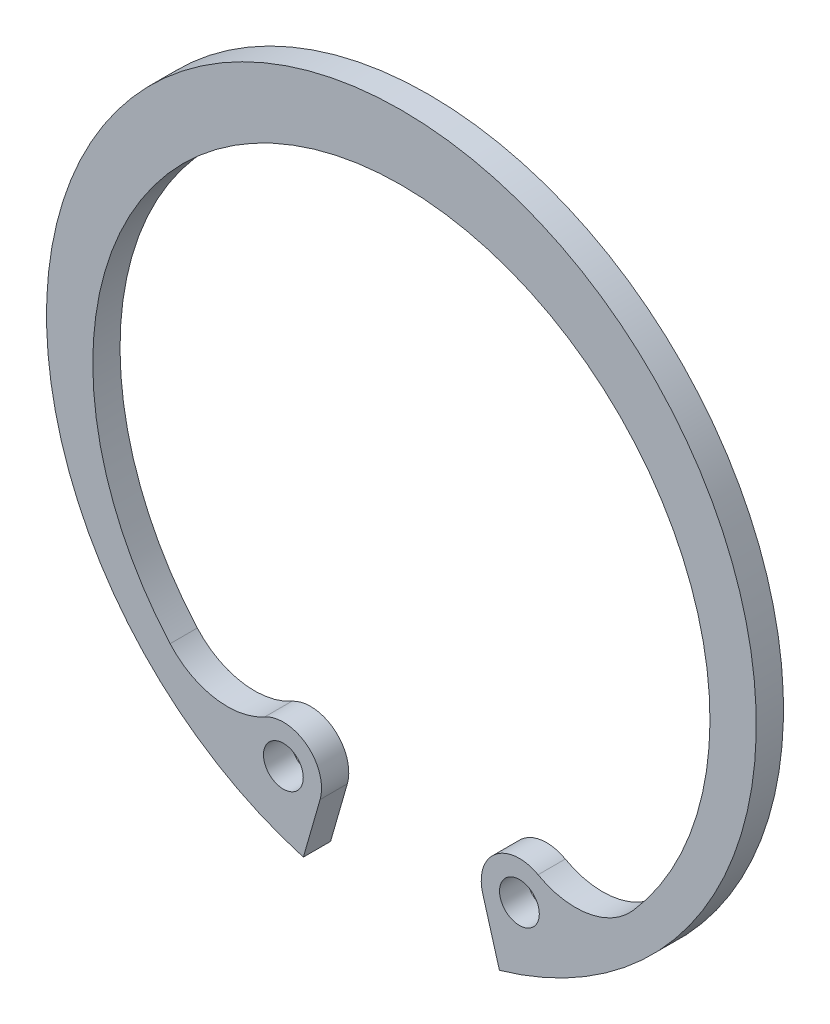
ISO-10303-21;
HEADER;
FILE_DESCRIPTION(('STEP AP214'),'2;1');
FILE_NAME('part.step','',(''),(''),'','','');
FILE_SCHEMA(('AUTOMOTIVE_DESIGN { 1 0 10303 214 1 1 1 1 }'));
ENDSEC;
DATA;
#1=APPLICATION_CONTEXT('core data for automotive mechanical design processes');
#2=APPLICATION_PROTOCOL_DEFINITION('international standard','automotive_design',2000,#1);
#3=PRODUCT_CONTEXT('',#1,'mechanical');
#4=PRODUCT('Part','Part','',(#3));
#5=PRODUCT_RELATED_PRODUCT_CATEGORY('part','',(#4));
#6=PRODUCT_DEFINITION_FORMATION('','',#4);
#7=PRODUCT_DEFINITION_CONTEXT('part definition',#1,'design');
#8=PRODUCT_DEFINITION('design','',#6,#7);
#9=PRODUCT_DEFINITION_SHAPE('','',#8);
#10=(LENGTH_UNIT() NAMED_UNIT(*) SI_UNIT(.MILLI.,.METRE.));
#11=(NAMED_UNIT(*) PLANE_ANGLE_UNIT() SI_UNIT($,.RADIAN.));
#12=(NAMED_UNIT(*) SI_UNIT($,.STERADIAN.) SOLID_ANGLE_UNIT());
#13=UNCERTAINTY_MEASURE_WITH_UNIT(LENGTH_MEASURE(1.E-05),#10,'distance_accuracy_value','');
#14=(GEOMETRIC_REPRESENTATION_CONTEXT(3) GLOBAL_UNCERTAINTY_ASSIGNED_CONTEXT((#13)) GLOBAL_UNIT_ASSIGNED_CONTEXT((#10,
#11,#12)) REPRESENTATION_CONTEXT('',''));
#15=CARTESIAN_POINT('',(0.,0.,0.));
#16=DIRECTION('',(0.,0.,1.));
#17=DIRECTION('',(1.,0.,0.));
#18=AXIS2_PLACEMENT_3D('',#15,#16,#17);
#19=CARTESIAN_POINT('',(0.,0.,-1.3));
#20=DIRECTION('',(0.,0.,1.));
#21=DIRECTION('',(1.,0.,0.));
#22=AXIS2_PLACEMENT_3D('',#19,#20,#21);
#23=CYLINDRICAL_SURFACE('',#22,16.95);
#24=CARTESIAN_POINT('',(0.,0.,0.));
#25=DIRECTION('',(0.,0.,1.));
#26=DIRECTION('',(1.,0.,0.));
#27=AXIS2_PLACEMENT_3D('',#24,#25,#26);
#28=CIRCLE('',#27,16.95);
#29=CARTESIAN_POINT('',(4.68211859774579,-16.2904961691363,0.));
#30=VERTEX_POINT('',#29);
#31=CARTESIAN_POINT('',(-4.68211859774579,-16.2904961691363,0.));
#32=VERTEX_POINT('',#31);
#33=EDGE_CURVE('E129',#30,#32,#28,.T.);
#34=ORIENTED_EDGE('',*,*,#33,.F.);
#35=DIRECTION('',(0.,0.,1.));
#36=VECTOR('',#35,1.);
#37=CARTESIAN_POINT('',(4.68211859774579,-16.2904961691363,-1.3));
#38=LINE('',#37,#36);
#39=CARTESIAN_POINT('',(4.68211859774579,-16.2904961691363,-1.3));
#40=VERTEX_POINT('',#39);
#41=EDGE_CURVE('E11',#40,#30,#38,.T.);
#42=ORIENTED_EDGE('',*,*,#41,.F.);
#43=CARTESIAN_POINT('',(0.,0.,-1.3));
#44=DIRECTION('',(0.,0.,1.));
#45=DIRECTION('',(1.,0.,0.));
#46=AXIS2_PLACEMENT_3D('',#43,#44,#45);
#47=CIRCLE('',#46,16.95);
#48=CARTESIAN_POINT('',(-4.68211859774579,-16.2904961691363,-1.3));
#49=VERTEX_POINT('',#48);
#50=EDGE_CURVE('E150',#40,#49,#47,.T.);
#51=ORIENTED_EDGE('',*,*,#50,.T.);
#52=DIRECTION('',(0.,0.,1.));
#53=VECTOR('',#52,1.);
#54=CARTESIAN_POINT('',(-4.68211859774579,-16.2904961691363,-1.3));
#55=LINE('',#54,#53);
#56=EDGE_CURVE('E35',#49,#32,#55,.T.);
#57=ORIENTED_EDGE('',*,*,#56,.T.);
#58=EDGE_LOOP('',(#34,#42,#51,#57));
#59=FACE_BOUND('',#58,.T.);
#60=ADVANCED_FACE('F32',(#59),#23,.T.);
#61=CARTESIAN_POINT('',(4.68211859774579,-16.2904961691363,-1.3));
#62=DIRECTION('',(-0.961091219418068,-0.276231185707717,0.));
#63=DIRECTION('',(0.276231185707717,-0.961091219418068,0.));
#64=AXIS2_PLACEMENT_3D('',#61,#62,#63);
#65=PLANE('',#64);
#66=DIRECTION('',(0.276231185707717,-0.961091219418068,0.));
#67=VECTOR('',#66,1.);
#68=CARTESIAN_POINT('',(4.68211859774579,-16.2904961691363,0.));
#69=LINE('',#68,#67);
#70=CARTESIAN_POINT('',(3.88298915635882,-13.5100849446478,0.));
#71=VERTEX_POINT('',#70);
#72=EDGE_CURVE('E148',#71,#30,#69,.T.);
#73=ORIENTED_EDGE('',*,*,#72,.F.);
#74=DIRECTION('',(0.,0.,1.));
#75=VECTOR('',#74,1.);
#76=CARTESIAN_POINT('',(3.88298915635882,-13.5100849446478,-1.3));
#77=LINE('',#76,#75);
#78=CARTESIAN_POINT('',(3.88298915635882,-13.5100849446478,-1.3));
#79=VERTEX_POINT('',#78);
#80=EDGE_CURVE('E41',#79,#71,#77,.T.);
#81=ORIENTED_EDGE('',*,*,#80,.F.);
#82=DIRECTION('',(0.276231185707717,-0.961091219418068,0.));
#83=VECTOR('',#82,1.);
#84=CARTESIAN_POINT('',(4.68211859774579,-16.2904961691363,-1.3));
#85=LINE('',#84,#83);
#86=EDGE_CURVE('E119',#79,#40,#85,.T.);
#87=ORIENTED_EDGE('',*,*,#86,.T.);
#88=ORIENTED_EDGE('',*,*,#41,.T.);
#89=EDGE_LOOP('',(#73,#81,#87,#88));
#90=FACE_BOUND('',#89,.T.);
#91=ADVANCED_FACE('F162',(#90),#65,.T.);
#92=CARTESIAN_POINT('',(5.6369806317968,-13.0059630307312,-1.3));
#93=DIRECTION('',(0.,0.,1.));
#94=DIRECTION('',(1.,0.,0.));
#95=AXIS2_PLACEMENT_3D('',#92,#93,#94);
#96=CYLINDRICAL_SURFACE('',#95,1.825);
#97=CARTESIAN_POINT('',(5.6369806317968,-13.0059630307312,0.));
#98=DIRECTION('',(0.,0.,1.));
#99=DIRECTION('',(1.,0.,0.));
#100=AXIS2_PLACEMENT_3D('',#97,#98,#99);
#101=CIRCLE('',#100,1.825);
#102=CARTESIAN_POINT('',(6.52840569211607,-11.4134849737914,0.));
#103=VERTEX_POINT('',#102);
#104=EDGE_CURVE('E106',#103,#71,#101,.T.);
#105=ORIENTED_EDGE('',*,*,#104,.F.);
#106=DIRECTION('',(0.,0.,1.));
#107=VECTOR('',#106,1.);
#108=CARTESIAN_POINT('',(6.52840569211607,-11.4134849737914,-1.3));
#109=LINE('',#108,#107);
#110=CARTESIAN_POINT('',(6.52840569211607,-11.4134849737914,-1.3));
#111=VERTEX_POINT('',#110);
#112=EDGE_CURVE('E101',#111,#103,#109,.T.);
#113=ORIENTED_EDGE('',*,*,#112,.F.);
#114=CARTESIAN_POINT('',(5.6369806317968,-13.0059630307312,-1.3));
#115=DIRECTION('',(0.,0.,1.));
#116=DIRECTION('',(1.,0.,0.));
#117=AXIS2_PLACEMENT_3D('',#114,#115,#116);
#118=CIRCLE('',#117,1.825);
#119=EDGE_CURVE('E104',#111,#79,#118,.T.);
#120=ORIENTED_EDGE('',*,*,#119,.T.);
#121=ORIENTED_EDGE('',*,*,#80,.T.);
#122=EDGE_LOOP('',(#105,#113,#120,#121));
#123=FACE_BOUND('',#122,.T.);
#124=ADVANCED_FACE('F103',(#123),#96,.T.);
#125=CARTESIAN_POINT('',(8.31125581275463,-8.22852885991183,-1.3));
#126=DIRECTION('',(0.,0.,1.));
#127=DIRECTION('',(1.,0.,0.));
#128=AXIS2_PLACEMENT_3D('',#125,#126,#127);
#129=CYLINDRICAL_SURFACE('',#128,3.65);
#130=CARTESIAN_POINT('',(8.31125581275463,-8.22852885991183,0.));
#131=DIRECTION('',(0.,0.,-1.));
#132=DIRECTION('',(1.,0.,0.));
#133=AXIS2_PLACEMENT_3D('',#130,#131,#132);
#134=CIRCLE('',#133,3.65);
#135=CARTESIAN_POINT('',(11.0470830170426,-10.6446723797132,0.));
#136=VERTEX_POINT('',#135);
#137=EDGE_CURVE('E145',#136,#103,#134,.T.);
#138=ORIENTED_EDGE('',*,*,#137,.F.);
#139=DIRECTION('',(0.,0.,1.));
#140=VECTOR('',#139,1.);
#141=CARTESIAN_POINT('',(11.0470830170426,-10.6446723797132,-1.3));
#142=LINE('',#141,#140);
#143=CARTESIAN_POINT('',(11.0470830170426,-10.6446723797132,-1.3));
#144=VERTEX_POINT('',#143);
#145=EDGE_CURVE('E111',#144,#136,#142,.T.);
#146=ORIENTED_EDGE('',*,*,#145,.F.);
#147=CARTESIAN_POINT('',(8.31125581275463,-8.22852885991183,-1.3));
#148=DIRECTION('',(0.,0.,-1.));
#149=DIRECTION('',(1.,0.,0.));
#150=AXIS2_PLACEMENT_3D('',#147,#148,#149);
#151=CIRCLE('',#150,3.65);
#152=EDGE_CURVE('E117',#144,#111,#151,.T.);
#153=ORIENTED_EDGE('',*,*,#152,.T.);
#154=ORIENTED_EDGE('',*,*,#112,.T.);
#155=EDGE_LOOP('',(#138,#146,#153,#154));
#156=FACE_BOUND('',#155,.T.);
#157=ADVANCED_FACE('F121',(#156),#129,.F.);
#158=CARTESIAN_POINT('',(0.,-0.888450202193896,-1.3));
#159=DIRECTION('',(0.,0.,1.));
#160=DIRECTION('',(1.,0.,0.));
#161=AXIS2_PLACEMENT_3D('',#158,#159,#160);
#162=CYLINDRICAL_SURFACE('',#161,14.7384502021939);
#163=CARTESIAN_POINT('',(0.,-0.888450202193896,0.));
#164=DIRECTION('',(0.,0.,-1.));
#165=DIRECTION('',(1.,0.,0.));
#166=AXIS2_PLACEMENT_3D('',#163,#164,#165);
#167=CIRCLE('',#166,14.7384502021939);
#168=CARTESIAN_POINT('',(-11.0470830170426,-10.6446723797132,0.));
#169=VERTEX_POINT('',#168);
#170=EDGE_CURVE('E142',#169,#136,#167,.T.);
#171=ORIENTED_EDGE('',*,*,#170,.F.);
#172=DIRECTION('',(0.,0.,1.));
#173=VECTOR('',#172,1.);
#174=CARTESIAN_POINT('',(-11.0470830170426,-10.6446723797132,-1.3));
#175=LINE('',#174,#173);
#176=CARTESIAN_POINT('',(-11.0470830170426,-10.6446723797132,-1.3));
#177=VERTEX_POINT('',#176);
#178=EDGE_CURVE('E154',#177,#169,#175,.T.);
#179=ORIENTED_EDGE('',*,*,#178,.F.);
#180=CARTESIAN_POINT('',(0.,-0.888450202193896,-1.3));
#181=DIRECTION('',(0.,0.,-1.));
#182=DIRECTION('',(1.,0.,0.));
#183=AXIS2_PLACEMENT_3D('',#180,#181,#182);
#184=CIRCLE('',#183,14.7384502021939);
#185=EDGE_CURVE('E122',#177,#144,#184,.T.);
#186=ORIENTED_EDGE('',*,*,#185,.T.);
#187=ORIENTED_EDGE('',*,*,#145,.T.);
#188=EDGE_LOOP('',(#171,#179,#186,#187));
#189=FACE_BOUND('',#188,.T.);
#190=ADVANCED_FACE('F175',(#189),#162,.F.);
#191=CARTESIAN_POINT('',(-8.31125581275462,-8.22852885991183,-1.3));
#192=DIRECTION('',(0.,0.,1.));
#193=DIRECTION('',(1.,0.,0.));
#194=AXIS2_PLACEMENT_3D('',#191,#192,#193);
#195=CYLINDRICAL_SURFACE('',#194,3.65);
#196=CARTESIAN_POINT('',(-8.31125581275462,-8.22852885991183,0.));
#197=DIRECTION('',(0.,0.,-1.));
#198=DIRECTION('',(1.,0.,0.));
#199=AXIS2_PLACEMENT_3D('',#196,#197,#198);
#200=CIRCLE('',#199,3.65);
#201=CARTESIAN_POINT('',(-6.52840569211607,-11.4134849737914,0.));
#202=VERTEX_POINT('',#201);
#203=EDGE_CURVE('E139',#202,#169,#200,.T.);
#204=ORIENTED_EDGE('',*,*,#203,.F.);
#205=DIRECTION('',(0.,0.,1.));
#206=VECTOR('',#205,1.);
#207=CARTESIAN_POINT('',(-6.52840569211607,-11.4134849737914,-1.3));
#208=LINE('',#207,#206);
#209=CARTESIAN_POINT('',(-6.52840569211607,-11.4134849737914,-1.3));
#210=VERTEX_POINT('',#209);
#211=EDGE_CURVE('E156',#210,#202,#208,.T.);
#212=ORIENTED_EDGE('',*,*,#211,.F.);
#213=CARTESIAN_POINT('',(-8.31125581275462,-8.22852885991183,-1.3));
#214=DIRECTION('',(0.,0.,-1.));
#215=DIRECTION('',(1.,0.,0.));
#216=AXIS2_PLACEMENT_3D('',#213,#214,#215);
#217=CIRCLE('',#216,3.65);
#218=EDGE_CURVE('E124',#210,#177,#217,.T.);
#219=ORIENTED_EDGE('',*,*,#218,.T.);
#220=ORIENTED_EDGE('',*,*,#178,.T.);
#221=EDGE_LOOP('',(#204,#212,#219,#220));
#222=FACE_BOUND('',#221,.T.);
#223=ADVANCED_FACE('F178',(#222),#195,.F.);
#224=CARTESIAN_POINT('',(-5.6369806317968,-13.0059630307312,-1.3));
#225=DIRECTION('',(0.,0.,1.));
#226=DIRECTION('',(1.,0.,0.));
#227=AXIS2_PLACEMENT_3D('',#224,#225,#226);
#228=CYLINDRICAL_SURFACE('',#227,1.825);
#229=CARTESIAN_POINT('',(-5.6369806317968,-13.0059630307312,0.));
#230=DIRECTION('',(0.,0.,1.));
#231=DIRECTION('',(1.,0.,0.));
#232=AXIS2_PLACEMENT_3D('',#229,#230,#231);
#233=CIRCLE('',#232,1.825);
#234=CARTESIAN_POINT('',(-3.88298915635882,-13.5100849446478,0.));
#235=VERTEX_POINT('',#234);
#236=EDGE_CURVE('E136',#235,#202,#233,.T.);
#237=ORIENTED_EDGE('',*,*,#236,.F.);
#238=DIRECTION('',(0.,0.,1.));
#239=VECTOR('',#238,1.);
#240=CARTESIAN_POINT('',(-3.88298915635882,-13.5100849446478,-1.3));
#241=LINE('',#240,#239);
#242=CARTESIAN_POINT('',(-3.88298915635882,-13.5100849446478,-1.3));
#243=VERTEX_POINT('',#242);
#244=EDGE_CURVE('E157',#243,#235,#241,.T.);
#245=ORIENTED_EDGE('',*,*,#244,.F.);
#246=CARTESIAN_POINT('',(-5.6369806317968,-13.0059630307312,-1.3));
#247=DIRECTION('',(0.,0.,1.));
#248=DIRECTION('',(1.,0.,0.));
#249=AXIS2_PLACEMENT_3D('',#246,#247,#248);
#250=CIRCLE('',#249,1.825);
#251=EDGE_CURVE('E224',#243,#210,#250,.T.);
#252=ORIENTED_EDGE('',*,*,#251,.T.);
#253=ORIENTED_EDGE('',*,*,#211,.T.);
#254=EDGE_LOOP('',(#237,#245,#252,#253));
#255=FACE_BOUND('',#254,.T.);
#256=ADVANCED_FACE('F182',(#255),#228,.T.);
#257=CARTESIAN_POINT('',(-4.68211859774579,-16.2904961691363,-1.3));
#258=DIRECTION('',(0.961091219418068,-0.276231185707716,0.));
#259=DIRECTION('',(0.276231185707716,0.961091219418068,0.));
#260=AXIS2_PLACEMENT_3D('',#257,#258,#259);
#261=PLANE('',#260);
#262=DIRECTION('',(0.276231185707716,0.961091219418068,0.));
#263=VECTOR('',#262,1.);
#264=CARTESIAN_POINT('',(-4.68211859774579,-16.2904961691363,0.));
#265=LINE('',#264,#263);
#266=EDGE_CURVE('E132',#32,#235,#265,.T.);
#267=ORIENTED_EDGE('',*,*,#266,.F.);
#268=ORIENTED_EDGE('',*,*,#56,.F.);
#269=DIRECTION('',(0.276231185707716,0.961091219418068,0.));
#270=VECTOR('',#269,1.);
#271=CARTESIAN_POINT('',(-4.68211859774579,-16.2904961691363,-1.3));
#272=LINE('',#271,#270);
#273=EDGE_CURVE('E222',#49,#243,#272,.T.);
#274=ORIENTED_EDGE('',*,*,#273,.T.);
#275=ORIENTED_EDGE('',*,*,#244,.T.);
#276=EDGE_LOOP('',(#267,#268,#274,#275));
#277=FACE_BOUND('',#276,.T.);
#278=ADVANCED_FACE('F159',(#277),#261,.T.);
#279=CARTESIAN_POINT('',(0.,0.,-1.3));
#280=DIRECTION('',(0.,0.,1.));
#281=DIRECTION('',(1.,0.,0.));
#282=AXIS2_PLACEMENT_3D('',#279,#280,#281);
#283=PLANE('',#282);
#284=CARTESIAN_POINT('',(-5.63698063179679,-13.0059630307312,-1.3));
#285=DIRECTION('',(0.,0.,1.));
#286=DIRECTION('',(1.,0.,0.));
#287=AXIS2_PLACEMENT_3D('',#284,#285,#286);
#288=CIRCLE('',#287,0.95);
#289=CARTESIAN_POINT('',(-4.68698063179679,-13.0059630307312,-1.3));
#290=VERTEX_POINT('',#289);
#291=EDGE_CURVE('E209',#290,#290,#288,.T.);
#292=ORIENTED_EDGE('',*,*,#291,.T.);
#293=EDGE_LOOP('',(#292));
#294=FACE_BOUND('',#293,.T.);
#295=CARTESIAN_POINT('',(5.6369806317968,-13.0059630307312,-1.3));
#296=DIRECTION('',(0.,0.,1.));
#297=DIRECTION('',(1.,0.,0.));
#298=AXIS2_PLACEMENT_3D('',#295,#296,#297);
#299=CIRCLE('',#298,0.95);
#300=CARTESIAN_POINT('',(6.58698063179679,-13.0059630307312,-1.3));
#301=VERTEX_POINT('',#300);
#302=EDGE_CURVE('E133',#301,#301,#299,.T.);
#303=ORIENTED_EDGE('',*,*,#302,.T.);
#304=EDGE_LOOP('',(#303));
#305=FACE_BOUND('',#304,.T.);
#306=ORIENTED_EDGE('',*,*,#50,.F.);
#307=ORIENTED_EDGE('',*,*,#86,.F.);
#308=ORIENTED_EDGE('',*,*,#119,.F.);
#309=ORIENTED_EDGE('',*,*,#152,.F.);
#310=ORIENTED_EDGE('',*,*,#185,.F.);
#311=ORIENTED_EDGE('',*,*,#218,.F.);
#312=ORIENTED_EDGE('',*,*,#251,.F.);
#313=ORIENTED_EDGE('',*,*,#273,.F.);
#314=EDGE_LOOP('',(#306,#307,#308,#309,#310,#311,#312,#313));
#315=FACE_BOUND('',#314,.T.);
#316=ADVANCED_FACE('F115',(#294,#305,#315),#283,.F.);
#317=CARTESIAN_POINT('',(0.,0.,0.));
#318=DIRECTION('',(0.,0.,1.));
#319=DIRECTION('',(1.,0.,0.));
#320=AXIS2_PLACEMENT_3D('',#317,#318,#319);
#321=PLANE('',#320);
#322=CARTESIAN_POINT('',(-5.63698063179679,-13.0059630307312,0.));
#323=DIRECTION('',(0.,0.,1.));
#324=DIRECTION('',(1.,0.,0.));
#325=AXIS2_PLACEMENT_3D('',#322,#323,#324);
#326=CIRCLE('',#325,0.95);
#327=CARTESIAN_POINT('',(-4.68698063179679,-13.0059630307312,0.));
#328=VERTEX_POINT('',#327);
#329=EDGE_CURVE('E212',#328,#328,#326,.T.);
#330=ORIENTED_EDGE('',*,*,#329,.F.);
#331=EDGE_LOOP('',(#330));
#332=FACE_BOUND('',#331,.T.);
#333=CARTESIAN_POINT('',(5.6369806317968,-13.0059630307312,0.));
#334=DIRECTION('',(0.,0.,1.));
#335=DIRECTION('',(1.,0.,0.));
#336=AXIS2_PLACEMENT_3D('',#333,#334,#335);
#337=CIRCLE('',#336,0.95);
#338=CARTESIAN_POINT('',(6.58698063179679,-13.0059630307312,0.));
#339=VERTEX_POINT('',#338);
#340=EDGE_CURVE('E214',#339,#339,#337,.T.);
#341=ORIENTED_EDGE('',*,*,#340,.F.);
#342=EDGE_LOOP('',(#341));
#343=FACE_BOUND('',#342,.T.);
#344=ORIENTED_EDGE('',*,*,#33,.T.);
#345=ORIENTED_EDGE('',*,*,#266,.T.);
#346=ORIENTED_EDGE('',*,*,#236,.T.);
#347=ORIENTED_EDGE('',*,*,#203,.T.);
#348=ORIENTED_EDGE('',*,*,#170,.T.);
#349=ORIENTED_EDGE('',*,*,#137,.T.);
#350=ORIENTED_EDGE('',*,*,#104,.T.);
#351=ORIENTED_EDGE('',*,*,#72,.T.);
#352=EDGE_LOOP('',(#344,#345,#346,#347,#348,#349,#350,#351));
#353=FACE_BOUND('',#352,.T.);
#354=ADVANCED_FACE('F161',(#332,#343,#353),#321,.T.);
#355=CARTESIAN_POINT('',(5.6369806317968,-13.0059630307312,-1.3));
#356=DIRECTION('',(0.,0.,1.));
#357=DIRECTION('',(1.,0.,0.));
#358=AXIS2_PLACEMENT_3D('',#355,#356,#357);
#359=CYLINDRICAL_SURFACE('',#358,0.95);
#360=ORIENTED_EDGE('',*,*,#302,.F.);
#361=EDGE_LOOP('',(#360));
#362=FACE_BOUND('',#361,.T.);
#363=ORIENTED_EDGE('',*,*,#340,.T.);
#364=EDGE_LOOP('',(#363));
#365=FACE_BOUND('',#364,.T.);
#366=ADVANCED_FACE('F194',(#362,#365),#359,.F.);
#367=CARTESIAN_POINT('',(-5.63698063179679,-13.0059630307312,-1.3));
#368=DIRECTION('',(0.,0.,1.));
#369=DIRECTION('',(1.,0.,0.));
#370=AXIS2_PLACEMENT_3D('',#367,#368,#369);
#371=CYLINDRICAL_SURFACE('',#370,0.95);
#372=ORIENTED_EDGE('',*,*,#291,.F.);
#373=EDGE_LOOP('',(#372));
#374=FACE_BOUND('',#373,.T.);
#375=ORIENTED_EDGE('',*,*,#329,.T.);
#376=EDGE_LOOP('',(#375));
#377=FACE_BOUND('',#376,.T.);
#378=ADVANCED_FACE('F201',(#374,#377),#371,.F.);
#379=CLOSED_SHELL('',(#60,#91,#124,#157,#190,#223,#256,#278,#316,#354,#366,#378));
#380=MANIFOLD_SOLID_BREP('B2',#379);
#381=ADVANCED_BREP_SHAPE_REPRESENTATION('',(#18,#380),#14);
#382=SHAPE_DEFINITION_REPRESENTATION(#9,#381);
ENDSEC;
END-ISO-10303-21;
